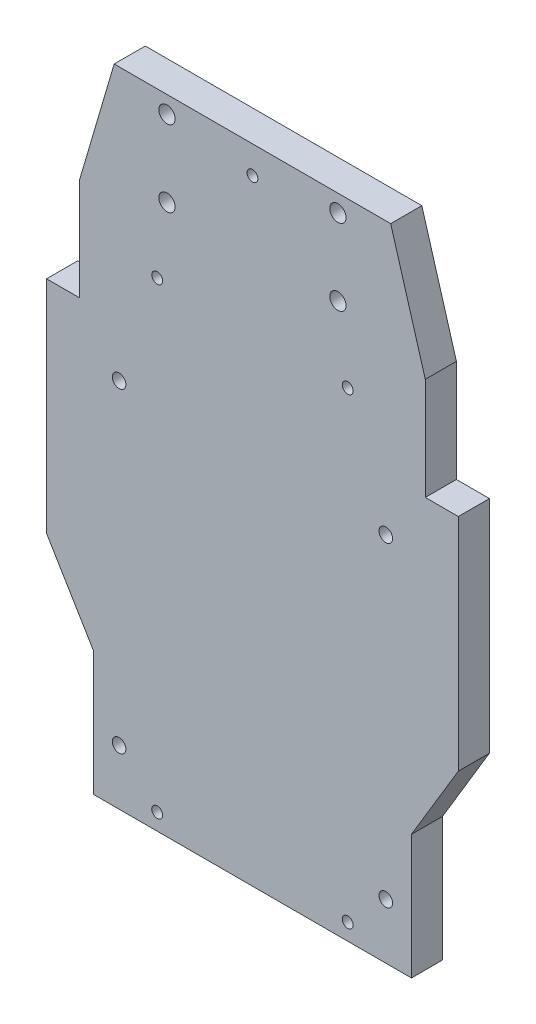
ISO-10303-21;
HEADER;
FILE_DESCRIPTION(('STEP AP214'),'2;1');
FILE_NAME('part.step','',(''),(''),'','','');
FILE_SCHEMA(('AUTOMOTIVE_DESIGN { 1 0 10303 214 1 1 1 1 }'));
ENDSEC;
DATA;
#1=APPLICATION_CONTEXT('core data for automotive mechanical design processes');
#2=APPLICATION_PROTOCOL_DEFINITION('international standard','automotive_design',2000,#1);
#3=PRODUCT_CONTEXT('',#1,'mechanical');
#4=PRODUCT('Part','Part','',(#3));
#5=PRODUCT_RELATED_PRODUCT_CATEGORY('part','',(#4));
#6=PRODUCT_DEFINITION_FORMATION('','',#4);
#7=PRODUCT_DEFINITION_CONTEXT('part definition',#1,'design');
#8=PRODUCT_DEFINITION('design','',#6,#7);
#9=PRODUCT_DEFINITION_SHAPE('','',#8);
#10=(LENGTH_UNIT() NAMED_UNIT(*) SI_UNIT(.MILLI.,.METRE.));
#11=(NAMED_UNIT(*) PLANE_ANGLE_UNIT() SI_UNIT($,.RADIAN.));
#12=(NAMED_UNIT(*) SI_UNIT($,.STERADIAN.) SOLID_ANGLE_UNIT());
#13=UNCERTAINTY_MEASURE_WITH_UNIT(LENGTH_MEASURE(1.E-05),#10,'distance_accuracy_value','');
#14=(GEOMETRIC_REPRESENTATION_CONTEXT(3) GLOBAL_UNCERTAINTY_ASSIGNED_CONTEXT((#13)) GLOBAL_UNIT_ASSIGNED_CONTEXT((#10,
#11,#12)) REPRESENTATION_CONTEXT('',''));
#15=CARTESIAN_POINT('',(0.,0.,0.));
#16=DIRECTION('',(0.,0.,1.));
#17=DIRECTION('',(1.,0.,0.));
#18=AXIS2_PLACEMENT_3D('',#15,#16,#17);
#19=CARTESIAN_POINT('',(31.75,20.2565,5.715));
#20=DIRECTION('',(0.,-1.,0.));
#21=DIRECTION('',(1.,0.,0.));
#22=AXIS2_PLACEMENT_3D('',#19,#20,#21);
#23=PLANE('',#22);
#24=DIRECTION('',(-1.,0.,0.));
#25=VECTOR('',#24,1.);
#26=CARTESIAN_POINT('',(31.75,20.2565,0.));
#27=LINE('',#26,#25);
#28=CARTESIAN_POINT('',(37.8206,20.2565,0.));
#29=VERTEX_POINT('',#28);
#30=CARTESIAN_POINT('',(31.75,20.2565,0.));
#31=VERTEX_POINT('',#30);
#32=EDGE_CURVE('E180',#29,#31,#27,.T.);
#33=ORIENTED_EDGE('',*,*,#32,.T.);
#34=DIRECTION('',(0.,0.,-1.));
#35=VECTOR('',#34,1.);
#36=CARTESIAN_POINT('',(31.75,20.2565,5.715));
#37=LINE('',#36,#35);
#38=CARTESIAN_POINT('',(31.75,20.2565,5.715));
#39=VERTEX_POINT('',#38);
#40=EDGE_CURVE('E11',#39,#31,#37,.T.);
#41=ORIENTED_EDGE('',*,*,#40,.F.);
#42=DIRECTION('',(-1.,0.,0.));
#43=VECTOR('',#42,1.);
#44=CARTESIAN_POINT('',(31.75,20.2565,5.715));
#45=LINE('',#44,#43);
#46=CARTESIAN_POINT('',(37.8206,20.2565,5.715));
#47=VERTEX_POINT('',#46);
#48=EDGE_CURVE('E221',#47,#39,#45,.T.);
#49=ORIENTED_EDGE('',*,*,#48,.F.);
#50=DIRECTION('',(0.,0.,-1.));
#51=VECTOR('',#50,1.);
#52=CARTESIAN_POINT('',(37.8206,20.2565,5.715));
#53=LINE('',#52,#51);
#54=EDGE_CURVE('E176',#47,#29,#53,.T.);
#55=ORIENTED_EDGE('',*,*,#54,.T.);
#56=EDGE_LOOP('',(#33,#41,#49,#55));
#57=FACE_BOUND('',#56,.T.);
#58=ADVANCED_FACE('F43',(#57),#23,.F.);
#59=CARTESIAN_POINT('',(31.75,39.0525,5.715));
#60=DIRECTION('',(-1.,0.,0.));
#61=DIRECTION('',(0.,-1.,0.));
#62=AXIS2_PLACEMENT_3D('',#59,#60,#61);
#63=PLANE('',#62);
#64=DIRECTION('',(0.,1.,0.));
#65=VECTOR('',#64,1.);
#66=CARTESIAN_POINT('',(31.75,39.0525,0.));
#67=LINE('',#66,#65);
#68=CARTESIAN_POINT('',(31.75,39.0525,0.));
#69=VERTEX_POINT('',#68);
#70=EDGE_CURVE('E184',#31,#69,#67,.T.);
#71=ORIENTED_EDGE('',*,*,#70,.T.);
#72=DIRECTION('',(0.,0.,-1.));
#73=VECTOR('',#72,1.);
#74=CARTESIAN_POINT('',(31.75,39.0525,5.715));
#75=LINE('',#74,#73);
#76=CARTESIAN_POINT('',(31.75,39.0525,5.715));
#77=VERTEX_POINT('',#76);
#78=EDGE_CURVE('E52',#77,#69,#75,.T.);
#79=ORIENTED_EDGE('',*,*,#78,.F.);
#80=DIRECTION('',(0.,1.,0.));
#81=VECTOR('',#80,1.);
#82=CARTESIAN_POINT('',(31.75,39.0525,5.715));
#83=LINE('',#82,#81);
#84=EDGE_CURVE('E121',#39,#77,#83,.T.);
#85=ORIENTED_EDGE('',*,*,#84,.F.);
#86=ORIENTED_EDGE('',*,*,#40,.T.);
#87=EDGE_LOOP('',(#71,#79,#85,#86));
#88=FACE_BOUND('',#87,.T.);
#89=ADVANCED_FACE('F330',(#88),#63,.F.);
#90=CARTESIAN_POINT('',(31.75,39.0525,5.715));
#91=DIRECTION('',(-0.959365501571269,-0.282166323991554,0.));
#92=DIRECTION('',(0.282166323991554,-0.95936550157127,0.));
#93=AXIS2_PLACEMENT_3D('',#90,#91,#92);
#94=PLANE('',#93);
#95=DIRECTION('',(-0.282166323991554,0.959365501571269,0.));
#96=VECTOR('',#95,1.);
#97=CARTESIAN_POINT('',(31.75,39.0525,0.));
#98=LINE('',#97,#96);
#99=CARTESIAN_POINT('',(25.3999999999999,60.6425,0.));
#100=VERTEX_POINT('',#99);
#101=EDGE_CURVE('E188',#69,#100,#98,.T.);
#102=ORIENTED_EDGE('',*,*,#101,.T.);
#103=DIRECTION('',(0.,0.,-1.));
#104=VECTOR('',#103,1.);
#105=CARTESIAN_POINT('',(25.3999999999999,60.6425,5.715));
#106=LINE('',#105,#104);
#107=CARTESIAN_POINT('',(25.3999999999999,60.6425,5.715));
#108=VERTEX_POINT('',#107);
#109=EDGE_CURVE('E256',#108,#100,#106,.T.);
#110=ORIENTED_EDGE('',*,*,#109,.F.);
#111=DIRECTION('',(-0.282166323991554,0.959365501571269,0.));
#112=VECTOR('',#111,1.);
#113=CARTESIAN_POINT('',(31.75,39.0525,5.715));
#114=LINE('',#113,#112);
#115=EDGE_CURVE('E266',#77,#108,#114,.T.);
#116=ORIENTED_EDGE('',*,*,#115,.F.);
#117=ORIENTED_EDGE('',*,*,#78,.T.);
#118=EDGE_LOOP('',(#102,#110,#116,#117));
#119=FACE_BOUND('',#118,.T.);
#120=ADVANCED_FACE('F264',(#119),#94,.F.);
#121=CARTESIAN_POINT('',(-25.3999999999999,60.6425,5.715));
#122=DIRECTION('',(0.,-1.,0.));
#123=DIRECTION('',(1.,0.,0.));
#124=AXIS2_PLACEMENT_3D('',#121,#122,#123);
#125=PLANE('',#124);
#126=DIRECTION('',(-1.,0.,0.));
#127=VECTOR('',#126,1.);
#128=CARTESIAN_POINT('',(-25.3999999999999,60.6425,0.));
#129=LINE('',#128,#127);
#130=CARTESIAN_POINT('',(-25.3999999999999,60.6425,0.));
#131=VERTEX_POINT('',#130);
#132=EDGE_CURVE('E191',#100,#131,#129,.T.);
#133=ORIENTED_EDGE('',*,*,#132,.T.);
#134=DIRECTION('',(0.,0.,-1.));
#135=VECTOR('',#134,1.);
#136=CARTESIAN_POINT('',(-25.3999999999999,60.6425,5.715));
#137=LINE('',#136,#135);
#138=CARTESIAN_POINT('',(-25.3999999999999,60.6425,5.715));
#139=VERTEX_POINT('',#138);
#140=EDGE_CURVE('E252',#139,#131,#137,.T.);
#141=ORIENTED_EDGE('',*,*,#140,.F.);
#142=DIRECTION('',(-1.,0.,0.));
#143=VECTOR('',#142,1.);
#144=CARTESIAN_POINT('',(-25.3999999999999,60.6425,5.715));
#145=LINE('',#144,#143);
#146=EDGE_CURVE('E285',#108,#139,#145,.T.);
#147=ORIENTED_EDGE('',*,*,#146,.F.);
#148=ORIENTED_EDGE('',*,*,#109,.T.);
#149=EDGE_LOOP('',(#133,#141,#147,#148));
#150=FACE_BOUND('',#149,.T.);
#151=ADVANCED_FACE('F275',(#150),#125,.F.);
#152=CARTESIAN_POINT('',(-31.75,39.0525,5.715));
#153=DIRECTION('',(0.959365501571271,-0.28216632399155,0.));
#154=DIRECTION('',(0.28216632399155,0.959365501571271,0.));
#155=AXIS2_PLACEMENT_3D('',#152,#153,#154);
#156=PLANE('',#155);
#157=DIRECTION('',(-0.28216632399155,-0.959365501571271,0.));
#158=VECTOR('',#157,1.);
#159=CARTESIAN_POINT('',(-31.75,39.0525,0.));
#160=LINE('',#159,#158);
#161=CARTESIAN_POINT('',(-31.75,39.0525,0.));
#162=VERTEX_POINT('',#161);
#163=EDGE_CURVE('E194',#131,#162,#160,.T.);
#164=ORIENTED_EDGE('',*,*,#163,.T.);
#165=DIRECTION('',(0.,0.,-1.));
#166=VECTOR('',#165,1.);
#167=CARTESIAN_POINT('',(-31.75,39.0525,5.715));
#168=LINE('',#167,#166);
#169=CARTESIAN_POINT('',(-31.75,39.0525,5.715));
#170=VERTEX_POINT('',#169);
#171=EDGE_CURVE('E248',#170,#162,#168,.T.);
#172=ORIENTED_EDGE('',*,*,#171,.F.);
#173=DIRECTION('',(-0.28216632399155,-0.959365501571271,0.));
#174=VECTOR('',#173,1.);
#175=CARTESIAN_POINT('',(-31.75,39.0525,5.715));
#176=LINE('',#175,#174);
#177=EDGE_CURVE('E281',#139,#170,#176,.T.);
#178=ORIENTED_EDGE('',*,*,#177,.F.);
#179=ORIENTED_EDGE('',*,*,#140,.T.);
#180=EDGE_LOOP('',(#164,#172,#178,#179));
#181=FACE_BOUND('',#180,.T.);
#182=ADVANCED_FACE('F279',(#181),#156,.F.);
#183=CARTESIAN_POINT('',(-31.75,39.0525,5.715));
#184=DIRECTION('',(1.,0.,0.));
#185=DIRECTION('',(0.,1.,0.));
#186=AXIS2_PLACEMENT_3D('',#183,#184,#185);
#187=PLANE('',#186);
#188=DIRECTION('',(0.,-1.,0.));
#189=VECTOR('',#188,1.);
#190=CARTESIAN_POINT('',(-31.75,39.0525,0.));
#191=LINE('',#190,#189);
#192=CARTESIAN_POINT('',(-31.75,20.2565,0.));
#193=VERTEX_POINT('',#192);
#194=EDGE_CURVE('E197',#162,#193,#191,.T.);
#195=ORIENTED_EDGE('',*,*,#194,.T.);
#196=DIRECTION('',(0.,0.,-1.));
#197=VECTOR('',#196,1.);
#198=CARTESIAN_POINT('',(-31.75,20.2565,5.715));
#199=LINE('',#198,#197);
#200=CARTESIAN_POINT('',(-31.75,20.2565,5.715));
#201=VERTEX_POINT('',#200);
#202=EDGE_CURVE('E244',#201,#193,#199,.T.);
#203=ORIENTED_EDGE('',*,*,#202,.F.);
#204=DIRECTION('',(0.,-1.,0.));
#205=VECTOR('',#204,1.);
#206=CARTESIAN_POINT('',(-31.75,39.0525,5.715));
#207=LINE('',#206,#205);
#208=EDGE_CURVE('E284',#170,#201,#207,.T.);
#209=ORIENTED_EDGE('',*,*,#208,.F.);
#210=ORIENTED_EDGE('',*,*,#171,.T.);
#211=EDGE_LOOP('',(#195,#203,#209,#210));
#212=FACE_BOUND('',#211,.T.);
#213=ADVANCED_FACE('F343',(#212),#187,.F.);
#214=CARTESIAN_POINT('',(-37.8206,20.2565,5.715));
#215=DIRECTION('',(0.,-1.,0.));
#216=DIRECTION('',(0.,0.,-1.));
#217=AXIS2_PLACEMENT_3D('',#214,#215,#216);
#218=PLANE('',#217);
#219=DIRECTION('',(-1.,0.,0.));
#220=VECTOR('',#219,1.);
#221=CARTESIAN_POINT('',(-37.8206,20.2565,0.));
#222=LINE('',#221,#220);
#223=CARTESIAN_POINT('',(-37.8206,20.2565,0.));
#224=VERTEX_POINT('',#223);
#225=EDGE_CURVE('E200',#193,#224,#222,.T.);
#226=ORIENTED_EDGE('',*,*,#225,.T.);
#227=DIRECTION('',(0.,0.,-1.));
#228=VECTOR('',#227,1.);
#229=CARTESIAN_POINT('',(-37.8206,20.2565,5.715));
#230=LINE('',#229,#228);
#231=CARTESIAN_POINT('',(-37.8206,20.2565,5.715));
#232=VERTEX_POINT('',#231);
#233=EDGE_CURVE('E240',#232,#224,#230,.T.);
#234=ORIENTED_EDGE('',*,*,#233,.F.);
#235=DIRECTION('',(-1.,0.,0.));
#236=VECTOR('',#235,1.);
#237=CARTESIAN_POINT('',(-37.8206,20.2565,5.715));
#238=LINE('',#237,#236);
#239=EDGE_CURVE('E289',#201,#232,#238,.T.);
#240=ORIENTED_EDGE('',*,*,#239,.F.);
#241=ORIENTED_EDGE('',*,*,#202,.T.);
#242=EDGE_LOOP('',(#226,#234,#240,#241));
#243=FACE_BOUND('',#242,.T.);
#244=ADVANCED_FACE('F346',(#243),#218,.F.);
#245=CARTESIAN_POINT('',(-37.8206,-20.2565,5.715));
#246=DIRECTION('',(1.,0.,0.));
#247=DIRECTION('',(0.,0.,-1.));
#248=AXIS2_PLACEMENT_3D('',#245,#246,#247);
#249=PLANE('',#248);
#250=DIRECTION('',(0.,-1.,0.));
#251=VECTOR('',#250,1.);
#252=CARTESIAN_POINT('',(-37.8206,-20.2565,0.));
#253=LINE('',#252,#251);
#254=CARTESIAN_POINT('',(-37.8206,-20.2565,0.));
#255=VERTEX_POINT('',#254);
#256=EDGE_CURVE('E203',#224,#255,#253,.T.);
#257=ORIENTED_EDGE('',*,*,#256,.T.);
#258=DIRECTION('',(0.,0.,-1.));
#259=VECTOR('',#258,1.);
#260=CARTESIAN_POINT('',(-37.8206,-20.2565,5.715));
#261=LINE('',#260,#259);
#262=CARTESIAN_POINT('',(-37.8206,-20.2565,5.715));
#263=VERTEX_POINT('',#262);
#264=EDGE_CURVE('E236',#263,#255,#261,.T.);
#265=ORIENTED_EDGE('',*,*,#264,.F.);
#266=DIRECTION('',(0.,-1.,0.));
#267=VECTOR('',#266,1.);
#268=CARTESIAN_POINT('',(-37.8206,-20.2565,5.715));
#269=LINE('',#268,#267);
#270=EDGE_CURVE('E296',#232,#263,#269,.T.);
#271=ORIENTED_EDGE('',*,*,#270,.F.);
#272=ORIENTED_EDGE('',*,*,#233,.T.);
#273=EDGE_LOOP('',(#257,#265,#271,#272));
#274=FACE_BOUND('',#273,.T.);
#275=ADVANCED_FACE('F350',(#274),#249,.F.);
#276=CARTESIAN_POINT('',(-29.21,-34.6075,5.715));
#277=DIRECTION('',(0.857492925712544,0.514495755427527,0.));
#278=DIRECTION('',(-0.514495755427527,0.857492925712544,0.));
#279=AXIS2_PLACEMENT_3D('',#276,#277,#278);
#280=PLANE('',#279);
#281=DIRECTION('',(0.514495755427527,-0.857492925712544,0.));
#282=VECTOR('',#281,1.);
#283=CARTESIAN_POINT('',(-29.21,-34.6075,0.));
#284=LINE('',#283,#282);
#285=CARTESIAN_POINT('',(-29.21,-34.6075,0.));
#286=VERTEX_POINT('',#285);
#287=EDGE_CURVE('E206',#255,#286,#284,.T.);
#288=ORIENTED_EDGE('',*,*,#287,.T.);
#289=DIRECTION('',(0.,0.,-1.));
#290=VECTOR('',#289,1.);
#291=CARTESIAN_POINT('',(-29.21,-34.6075,5.715));
#292=LINE('',#291,#290);
#293=CARTESIAN_POINT('',(-29.21,-34.6075,5.715));
#294=VERTEX_POINT('',#293);
#295=EDGE_CURVE('E232',#294,#286,#292,.T.);
#296=ORIENTED_EDGE('',*,*,#295,.F.);
#297=DIRECTION('',(0.514495755427527,-0.857492925712544,0.));
#298=VECTOR('',#297,1.);
#299=CARTESIAN_POINT('',(-29.21,-34.6075,5.715));
#300=LINE('',#299,#298);
#301=EDGE_CURVE('E299',#263,#294,#300,.T.);
#302=ORIENTED_EDGE('',*,*,#301,.F.);
#303=ORIENTED_EDGE('',*,*,#264,.T.);
#304=EDGE_LOOP('',(#288,#296,#302,#303));
#305=FACE_BOUND('',#304,.T.);
#306=ADVANCED_FACE('F354',(#305),#280,.F.);
#307=CARTESIAN_POINT('',(-29.21,-57.4675,5.715));
#308=DIRECTION('',(1.,0.,0.));
#309=DIRECTION('',(0.,0.,-1.));
#310=AXIS2_PLACEMENT_3D('',#307,#308,#309);
#311=PLANE('',#310);
#312=DIRECTION('',(0.,-1.,0.));
#313=VECTOR('',#312,1.);
#314=CARTESIAN_POINT('',(-29.21,-57.4675,0.));
#315=LINE('',#314,#313);
#316=CARTESIAN_POINT('',(-29.21,-57.4675,0.));
#317=VERTEX_POINT('',#316);
#318=EDGE_CURVE('E209',#286,#317,#315,.T.);
#319=ORIENTED_EDGE('',*,*,#318,.T.);
#320=DIRECTION('',(0.,0.,-1.));
#321=VECTOR('',#320,1.);
#322=CARTESIAN_POINT('',(-29.21,-57.4675,5.715));
#323=LINE('',#322,#321);
#324=CARTESIAN_POINT('',(-29.21,-57.4675,5.715));
#325=VERTEX_POINT('',#324);
#326=EDGE_CURVE('E228',#325,#317,#323,.T.);
#327=ORIENTED_EDGE('',*,*,#326,.F.);
#328=DIRECTION('',(0.,-1.,0.));
#329=VECTOR('',#328,1.);
#330=CARTESIAN_POINT('',(-29.21,-57.4675,5.715));
#331=LINE('',#330,#329);
#332=EDGE_CURVE('E302',#294,#325,#331,.T.);
#333=ORIENTED_EDGE('',*,*,#332,.F.);
#334=ORIENTED_EDGE('',*,*,#295,.T.);
#335=EDGE_LOOP('',(#319,#327,#333,#334));
#336=FACE_BOUND('',#335,.T.);
#337=ADVANCED_FACE('F310',(#336),#311,.F.);
#338=CARTESIAN_POINT('',(-29.21,-57.4675,5.715));
#339=DIRECTION('',(0.,1.,0.));
#340=DIRECTION('',(0.,0.,1.));
#341=AXIS2_PLACEMENT_3D('',#338,#339,#340);
#342=PLANE('',#341);
#343=DIRECTION('',(1.,0.,0.));
#344=VECTOR('',#343,1.);
#345=CARTESIAN_POINT('',(-29.21,-57.4675,0.));
#346=LINE('',#345,#344);
#347=CARTESIAN_POINT('',(29.21,-57.4675,0.));
#348=VERTEX_POINT('',#347);
#349=EDGE_CURVE('E212',#317,#348,#346,.T.);
#350=ORIENTED_EDGE('',*,*,#349,.T.);
#351=DIRECTION('',(0.,0.,-1.));
#352=VECTOR('',#351,1.);
#353=CARTESIAN_POINT('',(29.21,-57.4675,5.715));
#354=LINE('',#353,#352);
#355=CARTESIAN_POINT('',(29.21,-57.4675,5.715));
#356=VERTEX_POINT('',#355);
#357=EDGE_CURVE('E169',#356,#348,#354,.T.);
#358=ORIENTED_EDGE('',*,*,#357,.F.);
#359=DIRECTION('',(1.,0.,0.));
#360=VECTOR('',#359,1.);
#361=CARTESIAN_POINT('',(-29.21,-57.4675,5.715));
#362=LINE('',#361,#360);
#363=EDGE_CURVE('E158',#325,#356,#362,.T.);
#364=ORIENTED_EDGE('',*,*,#363,.F.);
#365=ORIENTED_EDGE('',*,*,#326,.T.);
#366=EDGE_LOOP('',(#350,#358,#364,#365));
#367=FACE_BOUND('',#366,.T.);
#368=ADVANCED_FACE('F314',(#367),#342,.F.);
#369=CARTESIAN_POINT('',(29.21,-57.4675,5.715));
#370=DIRECTION('',(-1.,0.,0.));
#371=DIRECTION('',(0.,0.,1.));
#372=AXIS2_PLACEMENT_3D('',#369,#370,#371);
#373=PLANE('',#372);
#374=DIRECTION('',(0.,1.,0.));
#375=VECTOR('',#374,1.);
#376=CARTESIAN_POINT('',(29.21,-57.4675,0.));
#377=LINE('',#376,#375);
#378=CARTESIAN_POINT('',(29.21,-34.6075,0.));
#379=VERTEX_POINT('',#378);
#380=EDGE_CURVE('E167',#348,#379,#377,.T.);
#381=ORIENTED_EDGE('',*,*,#380,.T.);
#382=DIRECTION('',(0.,0.,-1.));
#383=VECTOR('',#382,1.);
#384=CARTESIAN_POINT('',(29.21,-34.6075,5.715));
#385=LINE('',#384,#383);
#386=CARTESIAN_POINT('',(29.21,-34.6075,5.715));
#387=VERTEX_POINT('',#386);
#388=EDGE_CURVE('E164',#387,#379,#385,.T.);
#389=ORIENTED_EDGE('',*,*,#388,.F.);
#390=DIRECTION('',(0.,1.,0.));
#391=VECTOR('',#390,1.);
#392=CARTESIAN_POINT('',(29.21,-57.4675,5.715));
#393=LINE('',#392,#391);
#394=EDGE_CURVE('E152',#356,#387,#393,.T.);
#395=ORIENTED_EDGE('',*,*,#394,.F.);
#396=ORIENTED_EDGE('',*,*,#357,.T.);
#397=EDGE_LOOP('',(#381,#389,#395,#396));
#398=FACE_BOUND('',#397,.T.);
#399=ADVANCED_FACE('F165',(#398),#373,.F.);
#400=CARTESIAN_POINT('',(29.21,-34.6075,5.715));
#401=DIRECTION('',(-0.857492925712545,0.514495755427526,0.));
#402=DIRECTION('',(-0.514495755427526,-0.857492925712545,0.));
#403=AXIS2_PLACEMENT_3D('',#400,#401,#402);
#404=PLANE('',#403);
#405=DIRECTION('',(0.514495755427526,0.857492925712545,0.));
#406=VECTOR('',#405,1.);
#407=CARTESIAN_POINT('',(29.21,-34.6075,0.));
#408=LINE('',#407,#406);
#409=CARTESIAN_POINT('',(37.8206,-20.2565,0.));
#410=VERTEX_POINT('',#409);
#411=EDGE_CURVE('E107',#379,#410,#408,.T.);
#412=ORIENTED_EDGE('',*,*,#411,.T.);
#413=DIRECTION('',(0.,0.,-1.));
#414=VECTOR('',#413,1.);
#415=CARTESIAN_POINT('',(37.8206,-20.2565,5.715));
#416=LINE('',#415,#414);
#417=CARTESIAN_POINT('',(37.8206,-20.2565,5.715));
#418=VERTEX_POINT('',#417);
#419=EDGE_CURVE('E170',#418,#410,#416,.T.);
#420=ORIENTED_EDGE('',*,*,#419,.F.);
#421=DIRECTION('',(0.514495755427526,0.857492925712545,0.));
#422=VECTOR('',#421,1.);
#423=CARTESIAN_POINT('',(29.21,-34.6075,5.715));
#424=LINE('',#423,#422);
#425=EDGE_CURVE('E156',#387,#418,#424,.T.);
#426=ORIENTED_EDGE('',*,*,#425,.F.);
#427=ORIENTED_EDGE('',*,*,#388,.T.);
#428=EDGE_LOOP('',(#412,#420,#426,#427));
#429=FACE_BOUND('',#428,.T.);
#430=ADVANCED_FACE('F172',(#429),#404,.F.);
#431=CARTESIAN_POINT('',(37.8206,-20.2565,5.715));
#432=DIRECTION('',(-1.,0.,0.));
#433=DIRECTION('',(0.,0.,1.));
#434=AXIS2_PLACEMENT_3D('',#431,#432,#433);
#435=PLANE('',#434);
#436=DIRECTION('',(0.,1.,0.));
#437=VECTOR('',#436,1.);
#438=CARTESIAN_POINT('',(37.8206,-20.2565,0.));
#439=LINE('',#438,#437);
#440=EDGE_CURVE('E113',#410,#29,#439,.T.);
#441=ORIENTED_EDGE('',*,*,#440,.T.);
#442=ORIENTED_EDGE('',*,*,#54,.F.);
#443=DIRECTION('',(0.,1.,0.));
#444=VECTOR('',#443,1.);
#445=CARTESIAN_POINT('',(37.8206,-20.2565,5.715));
#446=LINE('',#445,#444);
#447=EDGE_CURVE('E60',#418,#47,#446,.T.);
#448=ORIENTED_EDGE('',*,*,#447,.F.);
#449=ORIENTED_EDGE('',*,*,#419,.T.);
#450=EDGE_LOOP('',(#441,#442,#448,#449));
#451=FACE_BOUND('',#450,.T.);
#452=ADVANCED_FACE('F318',(#451),#435,.F.);
#453=CARTESIAN_POINT('',(0.,0.,5.715));
#454=DIRECTION('',(0.,0.,1.));
#455=DIRECTION('',(1.,0.,0.));
#456=AXIS2_PLACEMENT_3D('',#453,#454,#455);
#457=PLANE('',#456);
#458=CARTESIAN_POINT('',(-17.5,-54.4375000000059,5.715));
#459=DIRECTION('',(0.,0.,1.));
#460=DIRECTION('',(1.,0.,0.));
#461=AXIS2_PLACEMENT_3D('',#458,#459,#460);
#462=CIRCLE('',#461,0.999999999999998);
#463=CARTESIAN_POINT('',(-16.5,-54.4375000000059,5.715));
#464=VERTEX_POINT('',#463);
#465=EDGE_CURVE('E650',#464,#464,#462,.T.);
#466=ORIENTED_EDGE('',*,*,#465,.F.);
#467=EDGE_LOOP('',(#466));
#468=FACE_BOUND('',#467,.T.);
#469=CARTESIAN_POINT('',(-17.5,30.562500000002,5.715));
#470=DIRECTION('',(0.,0.,1.));
#471=DIRECTION('',(1.,0.,0.));
#472=AXIS2_PLACEMENT_3D('',#469,#470,#471);
#473=CIRCLE('',#472,0.999999999999998);
#474=CARTESIAN_POINT('',(-16.5,30.562500000002,5.715));
#475=VERTEX_POINT('',#474);
#476=EDGE_CURVE('E657',#475,#475,#473,.T.);
#477=ORIENTED_EDGE('',*,*,#476,.F.);
#478=EDGE_LOOP('',(#477));
#479=FACE_BOUND('',#478,.T.);
#480=CARTESIAN_POINT('',(17.5,30.562500000002,5.715));
#481=DIRECTION('',(0.,0.,1.));
#482=DIRECTION('',(1.,0.,0.));
#483=AXIS2_PLACEMENT_3D('',#480,#481,#482);
#484=CIRCLE('',#483,0.999999999999998);
#485=CARTESIAN_POINT('',(18.5,30.562500000002,5.715));
#486=VERTEX_POINT('',#485);
#487=EDGE_CURVE('E714',#486,#486,#484,.T.);
#488=ORIENTED_EDGE('',*,*,#487,.F.);
#489=EDGE_LOOP('',(#488));
#490=FACE_BOUND('',#489,.T.);
#491=CARTESIAN_POINT('',(0.,55.5625,5.715));
#492=DIRECTION('',(0.,0.,1.));
#493=DIRECTION('',(1.,0.,0.));
#494=AXIS2_PLACEMENT_3D('',#491,#492,#493);
#495=CIRCLE('',#494,1.);
#496=CARTESIAN_POINT('',(1.,55.5625,5.715));
#497=VERTEX_POINT('',#496);
#498=EDGE_CURVE('E677',#497,#497,#495,.T.);
#499=ORIENTED_EDGE('',*,*,#498,.F.);
#500=EDGE_LOOP('',(#499));
#501=FACE_BOUND('',#500,.T.);
#502=CARTESIAN_POINT('',(24.5,10.6925,5.715));
#503=DIRECTION('',(0.,0.,1.));
#504=DIRECTION('',(1.,0.,0.));
#505=AXIS2_PLACEMENT_3D('',#502,#503,#504);
#506=CIRCLE('',#505,1.25);
#507=CARTESIAN_POINT('',(25.75,10.6925,5.715));
#508=VERTEX_POINT('',#507);
#509=EDGE_CURVE('E685',#508,#508,#506,.T.);
#510=ORIENTED_EDGE('',*,*,#509,.F.);
#511=EDGE_LOOP('',(#510));
#512=FACE_BOUND('',#511,.T.);
#513=CARTESIAN_POINT('',(-24.5,-47.3075,5.715));
#514=DIRECTION('',(0.,0.,1.));
#515=DIRECTION('',(1.,0.,0.));
#516=AXIS2_PLACEMENT_3D('',#513,#514,#515);
#517=CIRCLE('',#516,1.25);
#518=CARTESIAN_POINT('',(-23.25,-47.3075,5.715));
#519=VERTEX_POINT('',#518);
#520=EDGE_CURVE('E686',#519,#519,#517,.T.);
#521=ORIENTED_EDGE('',*,*,#520,.F.);
#522=EDGE_LOOP('',(#521));
#523=FACE_BOUND('',#522,.T.);
#524=CARTESIAN_POINT('',(24.5,-47.3075,5.715));
#525=DIRECTION('',(0.,0.,1.));
#526=DIRECTION('',(1.,0.,0.));
#527=AXIS2_PLACEMENT_3D('',#524,#525,#526);
#528=CIRCLE('',#527,1.25);
#529=CARTESIAN_POINT('',(25.75,-47.3075,5.715));
#530=VERTEX_POINT('',#529);
#531=EDGE_CURVE('E667',#530,#530,#528,.T.);
#532=ORIENTED_EDGE('',*,*,#531,.F.);
#533=EDGE_LOOP('',(#532));
#534=FACE_BOUND('',#533,.T.);
#535=CARTESIAN_POINT('',(-15.7,57.48249997,5.715));
#536=DIRECTION('',(0.,0.,1.));
#537=DIRECTION('',(1.,0.,0.));
#538=AXIS2_PLACEMENT_3D('',#535,#536,#537);
#539=CIRCLE('',#538,1.5);
#540=CARTESIAN_POINT('',(-14.2,57.48249997,5.715));
#541=VERTEX_POINT('',#540);
#542=EDGE_CURVE('E668',#541,#541,#539,.T.);
#543=ORIENTED_EDGE('',*,*,#542,.F.);
#544=EDGE_LOOP('',(#543));
#545=FACE_BOUND('',#544,.T.);
#546=CARTESIAN_POINT('',(15.7,57.48249997,5.715));
#547=DIRECTION('',(0.,0.,1.));
#548=DIRECTION('',(1.,0.,0.));
#549=AXIS2_PLACEMENT_3D('',#546,#547,#548);
#550=CIRCLE('',#549,1.5);
#551=CARTESIAN_POINT('',(17.2,57.48249997,5.715));
#552=VERTEX_POINT('',#551);
#553=EDGE_CURVE('E743',#552,#552,#550,.T.);
#554=ORIENTED_EDGE('',*,*,#553,.F.);
#555=EDGE_LOOP('',(#554));
#556=FACE_BOUND('',#555,.T.);
#557=CARTESIAN_POINT('',(-15.7,43.48249997,5.715));
#558=DIRECTION('',(0.,0.,1.));
#559=DIRECTION('',(1.,0.,0.));
#560=AXIS2_PLACEMENT_3D('',#557,#558,#559);
#561=CIRCLE('',#560,1.5);
#562=CARTESIAN_POINT('',(-14.2,43.48249997,5.715));
#563=VERTEX_POINT('',#562);
#564=EDGE_CURVE('E736',#563,#563,#561,.T.);
#565=ORIENTED_EDGE('',*,*,#564,.F.);
#566=EDGE_LOOP('',(#565));
#567=FACE_BOUND('',#566,.T.);
#568=CARTESIAN_POINT('',(15.7,43.48249997,5.715));
#569=DIRECTION('',(0.,0.,1.));
#570=DIRECTION('',(1.,0.,0.));
#571=AXIS2_PLACEMENT_3D('',#568,#569,#570);
#572=CIRCLE('',#571,1.5);
#573=CARTESIAN_POINT('',(17.2,43.48249997,5.715));
#574=VERTEX_POINT('',#573);
#575=EDGE_CURVE('E727',#574,#574,#572,.T.);
#576=ORIENTED_EDGE('',*,*,#575,.F.);
#577=EDGE_LOOP('',(#576));
#578=FACE_BOUND('',#577,.T.);
#579=CARTESIAN_POINT('',(17.5,-54.4375000000059,5.715));
#580=DIRECTION('',(0.,0.,1.));
#581=DIRECTION('',(1.,0.,0.));
#582=AXIS2_PLACEMENT_3D('',#579,#580,#581);
#583=CIRCLE('',#582,0.999999999999998);
#584=CARTESIAN_POINT('',(18.5,-54.4375000000059,5.715));
#585=VERTEX_POINT('',#584);
#586=EDGE_CURVE('E659',#585,#585,#583,.T.);
#587=ORIENTED_EDGE('',*,*,#586,.F.);
#588=EDGE_LOOP('',(#587));
#589=FACE_BOUND('',#588,.T.);
#590=CARTESIAN_POINT('',(-24.5,10.6925,5.715));
#591=DIRECTION('',(0.,0.,1.));
#592=DIRECTION('',(1.,0.,0.));
#593=AXIS2_PLACEMENT_3D('',#590,#591,#592);
#594=CIRCLE('',#593,1.25);
#595=CARTESIAN_POINT('',(-23.25,10.6925,5.715));
#596=VERTEX_POINT('',#595);
#597=EDGE_CURVE('E690',#596,#596,#594,.T.);
#598=ORIENTED_EDGE('',*,*,#597,.F.);
#599=EDGE_LOOP('',(#598));
#600=FACE_BOUND('',#599,.T.);
#601=ORIENTED_EDGE('',*,*,#48,.T.);
#602=ORIENTED_EDGE('',*,*,#84,.T.);
#603=ORIENTED_EDGE('',*,*,#115,.T.);
#604=ORIENTED_EDGE('',*,*,#146,.T.);
#605=ORIENTED_EDGE('',*,*,#177,.T.);
#606=ORIENTED_EDGE('',*,*,#208,.T.);
#607=ORIENTED_EDGE('',*,*,#239,.T.);
#608=ORIENTED_EDGE('',*,*,#270,.T.);
#609=ORIENTED_EDGE('',*,*,#301,.T.);
#610=ORIENTED_EDGE('',*,*,#332,.T.);
#611=ORIENTED_EDGE('',*,*,#363,.T.);
#612=ORIENTED_EDGE('',*,*,#394,.T.);
#613=ORIENTED_EDGE('',*,*,#425,.T.);
#614=ORIENTED_EDGE('',*,*,#447,.T.);
#615=EDGE_LOOP('',(#601,#602,#603,#604,#605,#606,#607,#608,#609,#610,#611,#612,#613,#614));
#616=FACE_BOUND('',#615,.T.);
#617=ADVANCED_FACE('F154',(#468,#479,#490,#501,#512,#523,#534,#545,#556,#567,#578,#589,#600,
#616),#457,.T.);
#618=CARTESIAN_POINT('',(0.,0.,0.));
#619=DIRECTION('',(0.,0.,1.));
#620=DIRECTION('',(1.,0.,0.));
#621=AXIS2_PLACEMENT_3D('',#618,#619,#620);
#622=PLANE('',#621);
#623=CARTESIAN_POINT('',(-17.5,-54.4375000000059,0.));
#624=DIRECTION('',(0.,0.,1.));
#625=DIRECTION('',(1.,0.,0.));
#626=AXIS2_PLACEMENT_3D('',#623,#624,#625);
#627=CIRCLE('',#626,0.999999999999998);
#628=CARTESIAN_POINT('',(-16.5,-54.4375000000059,0.));
#629=VERTEX_POINT('',#628);
#630=EDGE_CURVE('E647',#629,#629,#627,.F.);
#631=ORIENTED_EDGE('',*,*,#630,.F.);
#632=EDGE_LOOP('',(#631));
#633=FACE_BOUND('',#632,.T.);
#634=CARTESIAN_POINT('',(-17.5,30.562500000002,0.));
#635=DIRECTION('',(0.,0.,1.));
#636=DIRECTION('',(1.,0.,0.));
#637=AXIS2_PLACEMENT_3D('',#634,#635,#636);
#638=CIRCLE('',#637,0.999999999999998);
#639=CARTESIAN_POINT('',(-16.5,30.562500000002,0.));
#640=VERTEX_POINT('',#639);
#641=EDGE_CURVE('E652',#640,#640,#638,.F.);
#642=ORIENTED_EDGE('',*,*,#641,.F.);
#643=EDGE_LOOP('',(#642));
#644=FACE_BOUND('',#643,.T.);
#645=CARTESIAN_POINT('',(17.5,30.562500000002,0.));
#646=DIRECTION('',(0.,0.,1.));
#647=DIRECTION('',(1.,0.,0.));
#648=AXIS2_PLACEMENT_3D('',#645,#646,#647);
#649=CIRCLE('',#648,0.999999999999998);
#650=CARTESIAN_POINT('',(18.5,30.562500000002,0.));
#651=VERTEX_POINT('',#650);
#652=EDGE_CURVE('E718',#651,#651,#649,.F.);
#653=ORIENTED_EDGE('',*,*,#652,.F.);
#654=EDGE_LOOP('',(#653));
#655=FACE_BOUND('',#654,.T.);
#656=CARTESIAN_POINT('',(0.,55.5625,0.));
#657=DIRECTION('',(0.,0.,1.));
#658=DIRECTION('',(1.,0.,0.));
#659=AXIS2_PLACEMENT_3D('',#656,#657,#658);
#660=CIRCLE('',#659,1.);
#661=CARTESIAN_POINT('',(1.,55.5625,0.));
#662=VERTEX_POINT('',#661);
#663=EDGE_CURVE('E710',#662,#662,#660,.F.);
#664=ORIENTED_EDGE('',*,*,#663,.F.);
#665=EDGE_LOOP('',(#664));
#666=FACE_BOUND('',#665,.T.);
#667=CARTESIAN_POINT('',(24.5,10.6925,0.));
#668=DIRECTION('',(0.,0.,1.));
#669=DIRECTION('',(1.,0.,0.));
#670=AXIS2_PLACEMENT_3D('',#667,#668,#669);
#671=CIRCLE('',#670,1.25);
#672=CARTESIAN_POINT('',(25.75,10.6925,0.));
#673=VERTEX_POINT('',#672);
#674=EDGE_CURVE('E681',#673,#673,#671,.F.);
#675=ORIENTED_EDGE('',*,*,#674,.F.);
#676=EDGE_LOOP('',(#675));
#677=FACE_BOUND('',#676,.T.);
#678=CARTESIAN_POINT('',(-24.5,-47.3075,0.));
#679=DIRECTION('',(0.,0.,1.));
#680=DIRECTION('',(1.,0.,0.));
#681=AXIS2_PLACEMENT_3D('',#678,#679,#680);
#682=CIRCLE('',#681,1.25);
#683=CARTESIAN_POINT('',(-23.25,-47.3075,0.));
#684=VERTEX_POINT('',#683);
#685=EDGE_CURVE('E672',#684,#684,#682,.F.);
#686=ORIENTED_EDGE('',*,*,#685,.F.);
#687=EDGE_LOOP('',(#686));
#688=FACE_BOUND('',#687,.T.);
#689=CARTESIAN_POINT('',(24.5,-47.3075,0.));
#690=DIRECTION('',(0.,0.,1.));
#691=DIRECTION('',(1.,0.,0.));
#692=AXIS2_PLACEMENT_3D('',#689,#690,#691);
#693=CIRCLE('',#692,1.25);
#694=CARTESIAN_POINT('',(25.75,-47.3075,0.));
#695=VERTEX_POINT('',#694);
#696=EDGE_CURVE('E663',#695,#695,#693,.F.);
#697=ORIENTED_EDGE('',*,*,#696,.F.);
#698=EDGE_LOOP('',(#697));
#699=FACE_BOUND('',#698,.T.);
#700=CARTESIAN_POINT('',(-15.7,57.48249997,0.));
#701=DIRECTION('',(0.,0.,1.));
#702=DIRECTION('',(1.,0.,0.));
#703=AXIS2_PLACEMENT_3D('',#700,#701,#702);
#704=CIRCLE('',#703,1.5);
#705=CARTESIAN_POINT('',(-14.2,57.48249997,0.));
#706=VERTEX_POINT('',#705);
#707=EDGE_CURVE('E673',#706,#706,#704,.F.);
#708=ORIENTED_EDGE('',*,*,#707,.F.);
#709=EDGE_LOOP('',(#708));
#710=FACE_BOUND('',#709,.T.);
#711=CARTESIAN_POINT('',(15.7,57.48249997,0.));
#712=DIRECTION('',(0.,0.,1.));
#713=DIRECTION('',(1.,0.,0.));
#714=AXIS2_PLACEMENT_3D('',#711,#712,#713);
#715=CIRCLE('',#714,1.5);
#716=CARTESIAN_POINT('',(17.2,57.48249997,0.));
#717=VERTEX_POINT('',#716);
#718=EDGE_CURVE('E748',#717,#717,#715,.F.);
#719=ORIENTED_EDGE('',*,*,#718,.F.);
#720=EDGE_LOOP('',(#719));
#721=FACE_BOUND('',#720,.T.);
#722=CARTESIAN_POINT('',(-15.7,43.48249997,0.));
#723=DIRECTION('',(0.,0.,1.));
#724=DIRECTION('',(1.,0.,0.));
#725=AXIS2_PLACEMENT_3D('',#722,#723,#724);
#726=CIRCLE('',#725,1.5);
#727=CARTESIAN_POINT('',(-14.2,43.48249997,0.));
#728=VERTEX_POINT('',#727);
#729=EDGE_CURVE('E747',#728,#728,#726,.F.);
#730=ORIENTED_EDGE('',*,*,#729,.F.);
#731=EDGE_LOOP('',(#730));
#732=FACE_BOUND('',#731,.T.);
#733=CARTESIAN_POINT('',(15.7,43.48249997,0.));
#734=DIRECTION('',(0.,0.,1.));
#735=DIRECTION('',(1.,0.,0.));
#736=AXIS2_PLACEMENT_3D('',#733,#734,#735);
#737=CIRCLE('',#736,1.5);
#738=CARTESIAN_POINT('',(17.2,43.48249997,0.));
#739=VERTEX_POINT('',#738);
#740=EDGE_CURVE('E732',#739,#739,#737,.F.);
#741=ORIENTED_EDGE('',*,*,#740,.F.);
#742=EDGE_LOOP('',(#741));
#743=FACE_BOUND('',#742,.T.);
#744=CARTESIAN_POINT('',(17.5,-54.4375000000059,0.));
#745=DIRECTION('',(0.,0.,1.));
#746=DIRECTION('',(1.,0.,0.));
#747=AXIS2_PLACEMENT_3D('',#744,#745,#746);
#748=CIRCLE('',#747,0.999999999999998);
#749=CARTESIAN_POINT('',(18.5,-54.4375000000059,0.));
#750=VERTEX_POINT('',#749);
#751=EDGE_CURVE('E731',#750,#750,#748,.F.);
#752=ORIENTED_EDGE('',*,*,#751,.F.);
#753=EDGE_LOOP('',(#752));
#754=FACE_BOUND('',#753,.T.);
#755=CARTESIAN_POINT('',(-24.5,10.6925,0.));
#756=DIRECTION('',(0.,0.,1.));
#757=DIRECTION('',(1.,0.,0.));
#758=AXIS2_PLACEMENT_3D('',#755,#756,#757);
#759=CIRCLE('',#758,1.25);
#760=CARTESIAN_POINT('',(-23.25,10.6925,0.));
#761=VERTEX_POINT('',#760);
#762=EDGE_CURVE('E185',#761,#761,#759,.F.);
#763=ORIENTED_EDGE('',*,*,#762,.F.);
#764=EDGE_LOOP('',(#763));
#765=FACE_BOUND('',#764,.T.);
#766=ORIENTED_EDGE('',*,*,#32,.F.);
#767=ORIENTED_EDGE('',*,*,#440,.F.);
#768=ORIENTED_EDGE('',*,*,#411,.F.);
#769=ORIENTED_EDGE('',*,*,#380,.F.);
#770=ORIENTED_EDGE('',*,*,#349,.F.);
#771=ORIENTED_EDGE('',*,*,#318,.F.);
#772=ORIENTED_EDGE('',*,*,#287,.F.);
#773=ORIENTED_EDGE('',*,*,#256,.F.);
#774=ORIENTED_EDGE('',*,*,#225,.F.);
#775=ORIENTED_EDGE('',*,*,#194,.F.);
#776=ORIENTED_EDGE('',*,*,#163,.F.);
#777=ORIENTED_EDGE('',*,*,#132,.F.);
#778=ORIENTED_EDGE('',*,*,#101,.F.);
#779=ORIENTED_EDGE('',*,*,#70,.F.);
#780=EDGE_LOOP('',(#766,#767,#768,#769,#770,#771,#772,#773,#774,#775,#776,#777,#778,#779));
#781=FACE_BOUND('',#780,.T.);
#782=ADVANCED_FACE('F270',(#633,#644,#655,#666,#677,#688,#699,#710,#721,#732,#743,#754,#765,
#781),#622,.F.);
#783=CARTESIAN_POINT('',(-24.5,10.6925,-4.24264068711929));
#784=DIRECTION('',(0.,0.,1.));
#785=DIRECTION('',(1.,0.,0.));
#786=AXIS2_PLACEMENT_3D('',#783,#784,#785);
#787=CYLINDRICAL_SURFACE('',#786,1.25);
#788=ORIENTED_EDGE('',*,*,#762,.T.);
#789=EDGE_LOOP('',(#788));
#790=FACE_BOUND('',#789,.T.);
#791=ORIENTED_EDGE('',*,*,#597,.T.);
#792=EDGE_LOOP('',(#791));
#793=FACE_BOUND('',#792,.T.);
#794=ADVANCED_FACE('F394',(#790,#793),#787,.F.);
#795=CARTESIAN_POINT('',(17.5,-54.4375000000059,-4.24264068711929));
#796=DIRECTION('',(0.,0.,1.));
#797=DIRECTION('',(1.,0.,0.));
#798=AXIS2_PLACEMENT_3D('',#795,#796,#797);
#799=CYLINDRICAL_SURFACE('',#798,0.999999999999998);
#800=ORIENTED_EDGE('',*,*,#751,.T.);
#801=EDGE_LOOP('',(#800));
#802=FACE_BOUND('',#801,.T.);
#803=ORIENTED_EDGE('',*,*,#586,.T.);
#804=EDGE_LOOP('',(#803));
#805=FACE_BOUND('',#804,.T.);
#806=ADVANCED_FACE('F404',(#802,#805),#799,.F.);
#807=CARTESIAN_POINT('',(15.7,43.48249997,-4.24264068711929));
#808=DIRECTION('',(0.,0.,1.));
#809=DIRECTION('',(1.,0.,0.));
#810=AXIS2_PLACEMENT_3D('',#807,#808,#809);
#811=CYLINDRICAL_SURFACE('',#810,1.5);
#812=ORIENTED_EDGE('',*,*,#740,.T.);
#813=EDGE_LOOP('',(#812));
#814=FACE_BOUND('',#813,.T.);
#815=ORIENTED_EDGE('',*,*,#575,.T.);
#816=EDGE_LOOP('',(#815));
#817=FACE_BOUND('',#816,.T.);
#818=ADVANCED_FACE('F415',(#814,#817),#811,.F.);
#819=CARTESIAN_POINT('',(-15.7,43.48249997,-4.24264068711929));
#820=DIRECTION('',(0.,0.,1.));
#821=DIRECTION('',(1.,0.,0.));
#822=AXIS2_PLACEMENT_3D('',#819,#820,#821);
#823=CYLINDRICAL_SURFACE('',#822,1.5);
#824=ORIENTED_EDGE('',*,*,#729,.T.);
#825=EDGE_LOOP('',(#824));
#826=FACE_BOUND('',#825,.T.);
#827=ORIENTED_EDGE('',*,*,#564,.T.);
#828=EDGE_LOOP('',(#827));
#829=FACE_BOUND('',#828,.T.);
#830=ADVANCED_FACE('F426',(#826,#829),#823,.F.);
#831=CARTESIAN_POINT('',(15.7,57.48249997,-4.24264068711929));
#832=DIRECTION('',(0.,0.,1.));
#833=DIRECTION('',(1.,0.,0.));
#834=AXIS2_PLACEMENT_3D('',#831,#832,#833);
#835=CYLINDRICAL_SURFACE('',#834,1.5);
#836=ORIENTED_EDGE('',*,*,#718,.T.);
#837=EDGE_LOOP('',(#836));
#838=FACE_BOUND('',#837,.T.);
#839=ORIENTED_EDGE('',*,*,#553,.T.);
#840=EDGE_LOOP('',(#839));
#841=FACE_BOUND('',#840,.T.);
#842=ADVANCED_FACE('F437',(#838,#841),#835,.F.);
#843=CARTESIAN_POINT('',(-15.7,57.48249997,-4.24264068711929));
#844=DIRECTION('',(0.,0.,1.));
#845=DIRECTION('',(1.,0.,0.));
#846=AXIS2_PLACEMENT_3D('',#843,#844,#845);
#847=CYLINDRICAL_SURFACE('',#846,1.5);
#848=ORIENTED_EDGE('',*,*,#707,.T.);
#849=EDGE_LOOP('',(#848));
#850=FACE_BOUND('',#849,.T.);
#851=ORIENTED_EDGE('',*,*,#542,.T.);
#852=EDGE_LOOP('',(#851));
#853=FACE_BOUND('',#852,.T.);
#854=ADVANCED_FACE('F448',(#850,#853),#847,.F.);
#855=CARTESIAN_POINT('',(24.5,-47.3075,-4.24264068711929));
#856=DIRECTION('',(0.,0.,1.));
#857=DIRECTION('',(1.,0.,0.));
#858=AXIS2_PLACEMENT_3D('',#855,#856,#857);
#859=CYLINDRICAL_SURFACE('',#858,1.25);
#860=ORIENTED_EDGE('',*,*,#696,.T.);
#861=EDGE_LOOP('',(#860));
#862=FACE_BOUND('',#861,.T.);
#863=ORIENTED_EDGE('',*,*,#531,.T.);
#864=EDGE_LOOP('',(#863));
#865=FACE_BOUND('',#864,.T.);
#866=ADVANCED_FACE('F459',(#862,#865),#859,.F.);
#867=CARTESIAN_POINT('',(-24.5,-47.3075,-4.24264068711929));
#868=DIRECTION('',(0.,0.,1.));
#869=DIRECTION('',(1.,0.,0.));
#870=AXIS2_PLACEMENT_3D('',#867,#868,#869);
#871=CYLINDRICAL_SURFACE('',#870,1.25);
#872=ORIENTED_EDGE('',*,*,#685,.T.);
#873=EDGE_LOOP('',(#872));
#874=FACE_BOUND('',#873,.T.);
#875=ORIENTED_EDGE('',*,*,#520,.T.);
#876=EDGE_LOOP('',(#875));
#877=FACE_BOUND('',#876,.T.);
#878=ADVANCED_FACE('F470',(#874,#877),#871,.F.);
#879=CARTESIAN_POINT('',(24.5,10.6925,-4.24264068711929));
#880=DIRECTION('',(0.,0.,1.));
#881=DIRECTION('',(1.,0.,0.));
#882=AXIS2_PLACEMENT_3D('',#879,#880,#881);
#883=CYLINDRICAL_SURFACE('',#882,1.25);
#884=ORIENTED_EDGE('',*,*,#674,.T.);
#885=EDGE_LOOP('',(#884));
#886=FACE_BOUND('',#885,.T.);
#887=ORIENTED_EDGE('',*,*,#509,.T.);
#888=EDGE_LOOP('',(#887));
#889=FACE_BOUND('',#888,.T.);
#890=ADVANCED_FACE('F481',(#886,#889),#883,.F.);
#891=CARTESIAN_POINT('',(0.,55.5625,-4.24264068711929));
#892=DIRECTION('',(0.,0.,1.));
#893=DIRECTION('',(1.,0.,0.));
#894=AXIS2_PLACEMENT_3D('',#891,#892,#893);
#895=CYLINDRICAL_SURFACE('',#894,1.);
#896=ORIENTED_EDGE('',*,*,#663,.T.);
#897=EDGE_LOOP('',(#896));
#898=FACE_BOUND('',#897,.T.);
#899=ORIENTED_EDGE('',*,*,#498,.T.);
#900=EDGE_LOOP('',(#899));
#901=FACE_BOUND('',#900,.T.);
#902=ADVANCED_FACE('F492',(#898,#901),#895,.F.);
#903=CARTESIAN_POINT('',(17.5,30.562500000002,-4.24264068711929));
#904=DIRECTION('',(0.,0.,1.));
#905=DIRECTION('',(1.,0.,0.));
#906=AXIS2_PLACEMENT_3D('',#903,#904,#905);
#907=CYLINDRICAL_SURFACE('',#906,0.999999999999998);
#908=ORIENTED_EDGE('',*,*,#652,.T.);
#909=EDGE_LOOP('',(#908));
#910=FACE_BOUND('',#909,.T.);
#911=ORIENTED_EDGE('',*,*,#487,.T.);
#912=EDGE_LOOP('',(#911));
#913=FACE_BOUND('',#912,.T.);
#914=ADVANCED_FACE('F503',(#910,#913),#907,.F.);
#915=CARTESIAN_POINT('',(-17.5,30.562500000002,-4.24264068711929));
#916=DIRECTION('',(0.,0.,1.));
#917=DIRECTION('',(1.,0.,0.));
#918=AXIS2_PLACEMENT_3D('',#915,#916,#917);
#919=CYLINDRICAL_SURFACE('',#918,0.999999999999998);
#920=ORIENTED_EDGE('',*,*,#641,.T.);
#921=EDGE_LOOP('',(#920));
#922=FACE_BOUND('',#921,.T.);
#923=ORIENTED_EDGE('',*,*,#476,.T.);
#924=EDGE_LOOP('',(#923));
#925=FACE_BOUND('',#924,.T.);
#926=ADVANCED_FACE('F514',(#922,#925),#919,.F.);
#927=CARTESIAN_POINT('',(-17.5,-54.4375000000059,-4.24264068711929));
#928=DIRECTION('',(0.,0.,1.));
#929=DIRECTION('',(1.,0.,0.));
#930=AXIS2_PLACEMENT_3D('',#927,#928,#929);
#931=CYLINDRICAL_SURFACE('',#930,0.999999999999998);
#932=ORIENTED_EDGE('',*,*,#630,.T.);
#933=EDGE_LOOP('',(#932));
#934=FACE_BOUND('',#933,.T.);
#935=ORIENTED_EDGE('',*,*,#465,.T.);
#936=EDGE_LOOP('',(#935));
#937=FACE_BOUND('',#936,.T.);
#938=ADVANCED_FACE('F525',(#934,#937),#931,.F.);
#939=CLOSED_SHELL('',(#58,#89,#120,#151,#182,#213,#244,#275,#306,#337,#368,#399,#430,#452,#617,
#782,#794,#806,#818,#830,#842,#854,#866,#878,#890,#902,#914,#926,#938));
#940=MANIFOLD_SOLID_BREP('B2',#939);
#941=ADVANCED_BREP_SHAPE_REPRESENTATION('',(#18,#940),#14);
#942=SHAPE_DEFINITION_REPRESENTATION(#9,#941);
ENDSEC;
END-ISO-10303-21;
